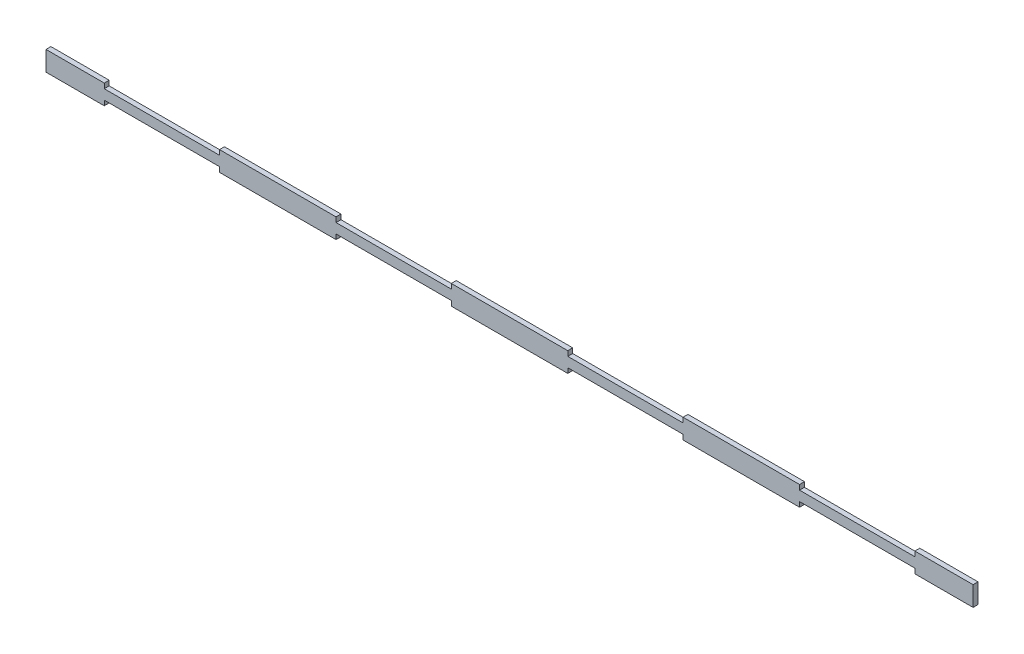
ISO-10303-21;
HEADER;
FILE_DESCRIPTION(('STEP AP214'),'2;1');
FILE_NAME('part.step','',(''),(''),'','','');
FILE_SCHEMA(('AUTOMOTIVE_DESIGN { 1 0 10303 214 1 1 1 1 }'));
ENDSEC;
DATA;
#1=APPLICATION_CONTEXT('core data for automotive mechanical design processes');
#2=APPLICATION_PROTOCOL_DEFINITION('international standard','automotive_design',2000,#1);
#3=PRODUCT_CONTEXT('',#1,'mechanical');
#4=PRODUCT('Part','Part','',(#3));
#5=PRODUCT_RELATED_PRODUCT_CATEGORY('part','',(#4));
#6=PRODUCT_DEFINITION_FORMATION('','',#4);
#7=PRODUCT_DEFINITION_CONTEXT('part definition',#1,'design');
#8=PRODUCT_DEFINITION('design','',#6,#7);
#9=PRODUCT_DEFINITION_SHAPE('','',#8);
#10=(LENGTH_UNIT() NAMED_UNIT(*) SI_UNIT(.MILLI.,.METRE.));
#11=(NAMED_UNIT(*) PLANE_ANGLE_UNIT() SI_UNIT($,.RADIAN.));
#12=(NAMED_UNIT(*) SI_UNIT($,.STERADIAN.) SOLID_ANGLE_UNIT());
#13=UNCERTAINTY_MEASURE_WITH_UNIT(LENGTH_MEASURE(1.E-05),#10,'distance_accuracy_value','');
#14=(GEOMETRIC_REPRESENTATION_CONTEXT(3) GLOBAL_UNCERTAINTY_ASSIGNED_CONTEXT((#13)) GLOBAL_UNIT_ASSIGNED_CONTEXT((#10,
#11,#12)) REPRESENTATION_CONTEXT('',''));
#15=CARTESIAN_POINT('',(0.,0.,0.));
#16=DIRECTION('',(0.,0.,1.));
#17=DIRECTION('',(1.,0.,0.));
#18=AXIS2_PLACEMENT_3D('',#15,#16,#17);
#19=CARTESIAN_POINT('',(186.73125,0.,-3.175));
#20=DIRECTION('',(-1.,0.,0.));
#21=DIRECTION('',(0.,0.,1.));
#22=AXIS2_PLACEMENT_3D('',#19,#20,#21);
#23=PLANE('',#22);
#24=DIRECTION('',(0.,-1.,0.));
#25=VECTOR('',#24,1.);
#26=CARTESIAN_POINT('',(186.73125,0.,0.));
#27=LINE('',#26,#25);
#28=CARTESIAN_POINT('',(186.73125,-9.52499999999988,0.));
#29=VERTEX_POINT('',#28);
#30=CARTESIAN_POINT('',(186.73125,-12.6999999999999,0.));
#31=VERTEX_POINT('',#30);
#32=EDGE_CURVE('E309',#29,#31,#27,.T.);
#33=ORIENTED_EDGE('',*,*,#32,.T.);
#34=DIRECTION('',(0.,0.,1.));
#35=VECTOR('',#34,1.);
#36=CARTESIAN_POINT('',(186.73125,-12.6999999999999,-3.175));
#37=LINE('',#36,#35);
#38=CARTESIAN_POINT('',(186.73125,-12.6999999999999,-3.175));
#39=VERTEX_POINT('',#38);
#40=EDGE_CURVE('E12',#39,#31,#37,.T.);
#41=ORIENTED_EDGE('',*,*,#40,.F.);
#42=DIRECTION('',(0.,-1.,0.));
#43=VECTOR('',#42,1.);
#44=CARTESIAN_POINT('',(186.73125,0.,-3.175));
#45=LINE('',#44,#43);
#46=CARTESIAN_POINT('',(186.73125,-9.52499999999988,-3.175));
#47=VERTEX_POINT('',#46);
#48=EDGE_CURVE('E700',#47,#39,#45,.T.);
#49=ORIENTED_EDGE('',*,*,#48,.F.);
#50=DIRECTION('',(0.,0.,1.));
#51=VECTOR('',#50,1.);
#52=CARTESIAN_POINT('',(186.73125,-9.52499999999988,-3.175));
#53=LINE('',#52,#51);
#54=EDGE_CURVE('E49',#47,#29,#53,.T.);
#55=ORIENTED_EDGE('',*,*,#54,.T.);
#56=EDGE_LOOP('',(#33,#41,#49,#55));
#57=FACE_BOUND('',#56,.T.);
#58=ADVANCED_FACE('F46',(#57),#23,.F.);
#59=CARTESIAN_POINT('',(0.,-12.6999999999999,-3.175));
#60=DIRECTION('',(0.,1.,0.));
#61=DIRECTION('',(0.,0.,1.));
#62=AXIS2_PLACEMENT_3D('',#59,#60,#61);
#63=PLANE('',#62);
#64=DIRECTION('',(-1.,0.,0.));
#65=VECTOR('',#64,1.);
#66=CARTESIAN_POINT('',(0.,-12.6999999999999,0.));
#67=LINE('',#66,#65);
#68=CARTESIAN_POINT('',(111.71875,-12.6999999999999,0.));
#69=VERTEX_POINT('',#68);
#70=EDGE_CURVE('E181',#31,#69,#67,.T.);
#71=ORIENTED_EDGE('',*,*,#70,.T.);
#72=DIRECTION('',(0.,0.,1.));
#73=VECTOR('',#72,1.);
#74=CARTESIAN_POINT('',(111.71875,-12.6999999999999,-3.175));
#75=LINE('',#74,#73);
#76=CARTESIAN_POINT('',(111.71875,-12.6999999999999,-3.175));
#77=VERTEX_POINT('',#76);
#78=EDGE_CURVE('E55',#77,#69,#75,.T.);
#79=ORIENTED_EDGE('',*,*,#78,.F.);
#80=DIRECTION('',(-1.,0.,0.));
#81=VECTOR('',#80,1.);
#82=CARTESIAN_POINT('',(0.,-12.6999999999999,-3.175));
#83=LINE('',#82,#81);
#84=EDGE_CURVE('E63',#39,#77,#83,.T.);
#85=ORIENTED_EDGE('',*,*,#84,.F.);
#86=ORIENTED_EDGE('',*,*,#40,.T.);
#87=EDGE_LOOP('',(#71,#79,#85,#86));
#88=FACE_BOUND('',#87,.T.);
#89=ADVANCED_FACE('F626',(#88),#63,.F.);
#90=CARTESIAN_POINT('',(111.71875,0.,-3.175));
#91=DIRECTION('',(-1.,0.,0.));
#92=DIRECTION('',(0.,0.,1.));
#93=AXIS2_PLACEMENT_3D('',#90,#91,#92);
#94=PLANE('',#93);
#95=DIRECTION('',(0.,-1.,0.));
#96=VECTOR('',#95,1.);
#97=CARTESIAN_POINT('',(111.71875,0.,0.));
#98=LINE('',#97,#96);
#99=CARTESIAN_POINT('',(111.71875,-9.52499999999986,0.));
#100=VERTEX_POINT('',#99);
#101=EDGE_CURVE('E289',#100,#69,#98,.T.);
#102=ORIENTED_EDGE('',*,*,#101,.F.);
#103=DIRECTION('',(0.,0.,1.));
#104=VECTOR('',#103,1.);
#105=CARTESIAN_POINT('',(111.71875,-9.52499999999986,-3.175));
#106=LINE('',#105,#104);
#107=CARTESIAN_POINT('',(111.71875,-9.52499999999986,-3.175));
#108=VERTEX_POINT('',#107);
#109=EDGE_CURVE('E285',#108,#100,#106,.T.);
#110=ORIENTED_EDGE('',*,*,#109,.F.);
#111=DIRECTION('',(0.,-1.,0.));
#112=VECTOR('',#111,1.);
#113=CARTESIAN_POINT('',(111.71875,0.,-3.175));
#114=LINE('',#113,#112);
#115=EDGE_CURVE('E288',#108,#77,#114,.T.);
#116=ORIENTED_EDGE('',*,*,#115,.T.);
#117=ORIENTED_EDGE('',*,*,#78,.T.);
#118=EDGE_LOOP('',(#102,#110,#116,#117));
#119=FACE_BOUND('',#118,.T.);
#120=ADVANCED_FACE('F287',(#119),#94,.T.);
#121=CARTESIAN_POINT('',(0.,-9.52499999999986,-3.175));
#122=DIRECTION('',(0.,-1.,0.));
#123=DIRECTION('',(0.,0.,-1.));
#124=AXIS2_PLACEMENT_3D('',#121,#122,#123);
#125=PLANE('',#124);
#126=DIRECTION('',(1.,0.,0.));
#127=VECTOR('',#126,1.);
#128=CARTESIAN_POINT('',(0.,-9.52499999999986,0.));
#129=LINE('',#128,#127);
#130=CARTESIAN_POINT('',(37.50625,-9.52499999999986,0.));
#131=VERTEX_POINT('',#130);
#132=EDGE_CURVE('E704',#131,#100,#129,.T.);
#133=ORIENTED_EDGE('',*,*,#132,.F.);
#134=DIRECTION('',(0.,0.,1.));
#135=VECTOR('',#134,1.);
#136=CARTESIAN_POINT('',(37.50625,-9.52499999999986,-3.175));
#137=LINE('',#136,#135);
#138=CARTESIAN_POINT('',(37.50625,-9.52499999999986,-3.175));
#139=VERTEX_POINT('',#138);
#140=EDGE_CURVE('E294',#139,#131,#137,.T.);
#141=ORIENTED_EDGE('',*,*,#140,.F.);
#142=DIRECTION('',(1.,0.,0.));
#143=VECTOR('',#142,1.);
#144=CARTESIAN_POINT('',(0.,-9.52499999999986,-3.175));
#145=LINE('',#144,#143);
#146=EDGE_CURVE('E299',#139,#108,#145,.T.);
#147=ORIENTED_EDGE('',*,*,#146,.T.);
#148=ORIENTED_EDGE('',*,*,#109,.T.);
#149=EDGE_LOOP('',(#133,#141,#147,#148));
#150=FACE_BOUND('',#149,.T.);
#151=ADVANCED_FACE('F301',(#150),#125,.T.);
#152=CARTESIAN_POINT('',(37.50625,0.,-3.175));
#153=DIRECTION('',(-1.,0.,0.));
#154=DIRECTION('',(0.,0.,1.));
#155=AXIS2_PLACEMENT_3D('',#152,#153,#154);
#156=PLANE('',#155);
#157=DIRECTION('',(0.,-1.,0.));
#158=VECTOR('',#157,1.);
#159=CARTESIAN_POINT('',(37.50625,0.,0.));
#160=LINE('',#159,#158);
#161=CARTESIAN_POINT('',(37.50625,-12.6999999999999,0.));
#162=VERTEX_POINT('',#161);
#163=EDGE_CURVE('E706',#131,#162,#160,.T.);
#164=ORIENTED_EDGE('',*,*,#163,.T.);
#165=DIRECTION('',(0.,0.,1.));
#166=VECTOR('',#165,1.);
#167=CARTESIAN_POINT('',(37.50625,-12.6999999999999,-3.175));
#168=LINE('',#167,#166);
#169=CARTESIAN_POINT('',(37.50625,-12.6999999999999,-3.175));
#170=VERTEX_POINT('',#169);
#171=EDGE_CURVE('E724',#170,#162,#168,.T.);
#172=ORIENTED_EDGE('',*,*,#171,.F.);
#173=DIRECTION('',(0.,-1.,0.));
#174=VECTOR('',#173,1.);
#175=CARTESIAN_POINT('',(37.50625,0.,-3.175));
#176=LINE('',#175,#174);
#177=EDGE_CURVE('E303',#139,#170,#176,.T.);
#178=ORIENTED_EDGE('',*,*,#177,.F.);
#179=ORIENTED_EDGE('',*,*,#140,.T.);
#180=EDGE_LOOP('',(#164,#172,#178,#179));
#181=FACE_BOUND('',#180,.T.);
#182=ADVANCED_FACE('F730',(#181),#156,.F.);
#183=CARTESIAN_POINT('',(-37.50625,-12.6999999999999,0.));
#184=VERTEX_POINT('',#183);
#185=EDGE_CURVE('E703',#162,#184,#67,.T.);
#186=ORIENTED_EDGE('',*,*,#185,.T.);
#187=DIRECTION('',(0.,0.,1.));
#188=VECTOR('',#187,1.);
#189=CARTESIAN_POINT('',(-37.50625,-12.6999999999999,-3.175));
#190=LINE('',#189,#188);
#191=CARTESIAN_POINT('',(-37.50625,-12.6999999999999,-3.175));
#192=VERTEX_POINT('',#191);
#193=EDGE_CURVE('E469',#192,#184,#190,.T.);
#194=ORIENTED_EDGE('',*,*,#193,.F.);
#195=EDGE_CURVE('E305',#170,#192,#83,.T.);
#196=ORIENTED_EDGE('',*,*,#195,.F.);
#197=ORIENTED_EDGE('',*,*,#171,.T.);
#198=EDGE_LOOP('',(#186,#194,#196,#197));
#199=FACE_BOUND('',#198,.T.);
#200=ADVANCED_FACE('F632',(#199),#63,.F.);
#201=CARTESIAN_POINT('',(-37.50625,0.,-3.175));
#202=DIRECTION('',(-1.,0.,0.));
#203=DIRECTION('',(0.,0.,1.));
#204=AXIS2_PLACEMENT_3D('',#201,#202,#203);
#205=PLANE('',#204);
#206=DIRECTION('',(0.,-1.,0.));
#207=VECTOR('',#206,1.);
#208=CARTESIAN_POINT('',(-37.50625,0.,0.));
#209=LINE('',#208,#207);
#210=CARTESIAN_POINT('',(-37.50625,-9.52499999999984,0.));
#211=VERTEX_POINT('',#210);
#212=EDGE_CURVE('E707',#211,#184,#209,.T.);
#213=ORIENTED_EDGE('',*,*,#212,.F.);
#214=DIRECTION('',(0.,0.,1.));
#215=VECTOR('',#214,1.);
#216=CARTESIAN_POINT('',(-37.50625,-9.52499999999984,-3.175));
#217=LINE('',#216,#215);
#218=CARTESIAN_POINT('',(-37.50625,-9.52499999999984,-3.175));
#219=VERTEX_POINT('',#218);
#220=EDGE_CURVE('E471',#219,#211,#217,.T.);
#221=ORIENTED_EDGE('',*,*,#220,.F.);
#222=DIRECTION('',(0.,-1.,0.));
#223=VECTOR('',#222,1.);
#224=CARTESIAN_POINT('',(-37.50625,0.,-3.175));
#225=LINE('',#224,#223);
#226=EDGE_CURVE('E428',#219,#192,#225,.T.);
#227=ORIENTED_EDGE('',*,*,#226,.T.);
#228=ORIENTED_EDGE('',*,*,#193,.T.);
#229=EDGE_LOOP('',(#213,#221,#227,#228));
#230=FACE_BOUND('',#229,.T.);
#231=ADVANCED_FACE('F467',(#230),#205,.T.);
#232=CARTESIAN_POINT('',(0.,-9.52499999999984,-3.175));
#233=DIRECTION('',(0.,-1.,0.));
#234=DIRECTION('',(0.,0.,-1.));
#235=AXIS2_PLACEMENT_3D('',#232,#233,#234);
#236=PLANE('',#235);
#237=DIRECTION('',(1.,0.,0.));
#238=VECTOR('',#237,1.);
#239=CARTESIAN_POINT('',(0.,-9.52499999999984,0.));
#240=LINE('',#239,#238);
#241=CARTESIAN_POINT('',(-111.71875,-9.52499999999984,0.));
#242=VERTEX_POINT('',#241);
#243=EDGE_CURVE('E480',#242,#211,#240,.T.);
#244=ORIENTED_EDGE('',*,*,#243,.F.);
#245=DIRECTION('',(0.,0.,1.));
#246=VECTOR('',#245,1.);
#247=CARTESIAN_POINT('',(-111.71875,-9.52499999999984,-3.175));
#248=LINE('',#247,#246);
#249=CARTESIAN_POINT('',(-111.71875,-9.52499999999984,-3.175));
#250=VERTEX_POINT('',#249);
#251=EDGE_CURVE('E477',#250,#242,#248,.T.);
#252=ORIENTED_EDGE('',*,*,#251,.F.);
#253=DIRECTION('',(1.,0.,0.));
#254=VECTOR('',#253,1.);
#255=CARTESIAN_POINT('',(0.,-9.52499999999984,-3.175));
#256=LINE('',#255,#254);
#257=EDGE_CURVE('E454',#250,#219,#256,.T.);
#258=ORIENTED_EDGE('',*,*,#257,.T.);
#259=ORIENTED_EDGE('',*,*,#220,.T.);
#260=EDGE_LOOP('',(#244,#252,#258,#259));
#261=FACE_BOUND('',#260,.T.);
#262=ADVANCED_FACE('F476',(#261),#236,.T.);
#263=CARTESIAN_POINT('',(-111.71875,0.,-3.175));
#264=DIRECTION('',(-1.,0.,0.));
#265=DIRECTION('',(0.,0.,1.));
#266=AXIS2_PLACEMENT_3D('',#263,#264,#265);
#267=PLANE('',#266);
#268=DIRECTION('',(0.,-1.,0.));
#269=VECTOR('',#268,1.);
#270=CARTESIAN_POINT('',(-111.71875,0.,0.));
#271=LINE('',#270,#269);
#272=CARTESIAN_POINT('',(-111.71875,-12.6999999999999,0.));
#273=VERTEX_POINT('',#272);
#274=EDGE_CURVE('E488',#242,#273,#271,.T.);
#275=ORIENTED_EDGE('',*,*,#274,.T.);
#276=DIRECTION('',(0.,0.,1.));
#277=VECTOR('',#276,1.);
#278=CARTESIAN_POINT('',(-111.71875,-12.6999999999999,-3.175));
#279=LINE('',#278,#277);
#280=CARTESIAN_POINT('',(-111.71875,-12.6999999999999,-3.175));
#281=VERTEX_POINT('',#280);
#282=EDGE_CURVE('E483',#281,#273,#279,.T.);
#283=ORIENTED_EDGE('',*,*,#282,.F.);
#284=DIRECTION('',(0.,-1.,0.));
#285=VECTOR('',#284,1.);
#286=CARTESIAN_POINT('',(-111.71875,0.,-3.175));
#287=LINE('',#286,#285);
#288=EDGE_CURVE('E449',#250,#281,#287,.T.);
#289=ORIENTED_EDGE('',*,*,#288,.F.);
#290=ORIENTED_EDGE('',*,*,#251,.T.);
#291=EDGE_LOOP('',(#275,#283,#289,#290));
#292=FACE_BOUND('',#291,.T.);
#293=ADVANCED_FACE('F486',(#292),#267,.F.);
#294=CARTESIAN_POINT('',(-186.73125,-12.6999999999999,0.));
#295=VERTEX_POINT('',#294);
#296=EDGE_CURVE('E495',#273,#295,#67,.T.);
#297=ORIENTED_EDGE('',*,*,#296,.T.);
#298=DIRECTION('',(0.,0.,1.));
#299=VECTOR('',#298,1.);
#300=CARTESIAN_POINT('',(-186.73125,-12.6999999999999,-3.175));
#301=LINE('',#300,#299);
#302=CARTESIAN_POINT('',(-186.73125,-12.6999999999999,-3.175));
#303=VERTEX_POINT('',#302);
#304=EDGE_CURVE('E492',#303,#295,#301,.T.);
#305=ORIENTED_EDGE('',*,*,#304,.F.);
#306=EDGE_CURVE('E429',#281,#303,#83,.T.);
#307=ORIENTED_EDGE('',*,*,#306,.F.);
#308=ORIENTED_EDGE('',*,*,#282,.T.);
#309=EDGE_LOOP('',(#297,#305,#307,#308));
#310=FACE_BOUND('',#309,.T.);
#311=ADVANCED_FACE('F494',(#310),#63,.F.);
#312=CARTESIAN_POINT('',(-186.73125,0.,-3.175));
#313=DIRECTION('',(-1.,0.,0.));
#314=DIRECTION('',(0.,0.,1.));
#315=AXIS2_PLACEMENT_3D('',#312,#313,#314);
#316=PLANE('',#315);
#317=DIRECTION('',(0.,-1.,0.));
#318=VECTOR('',#317,1.);
#319=CARTESIAN_POINT('',(-186.73125,0.,0.));
#320=LINE('',#319,#318);
#321=CARTESIAN_POINT('',(-186.73125,-9.52499999999982,0.));
#322=VERTEX_POINT('',#321);
#323=EDGE_CURVE('E714',#322,#295,#320,.T.);
#324=ORIENTED_EDGE('',*,*,#323,.F.);
#325=DIRECTION('',(0.,0.,1.));
#326=VECTOR('',#325,1.);
#327=CARTESIAN_POINT('',(-186.73125,-9.52499999999982,-3.175));
#328=LINE('',#327,#326);
#329=CARTESIAN_POINT('',(-186.73125,-9.52499999999982,-3.175));
#330=VERTEX_POINT('',#329);
#331=EDGE_CURVE('E498',#330,#322,#328,.T.);
#332=ORIENTED_EDGE('',*,*,#331,.F.);
#333=DIRECTION('',(0.,-1.,0.));
#334=VECTOR('',#333,1.);
#335=CARTESIAN_POINT('',(-186.73125,0.,-3.175));
#336=LINE('',#335,#334);
#337=EDGE_CURVE('E450',#330,#303,#336,.T.);
#338=ORIENTED_EDGE('',*,*,#337,.T.);
#339=ORIENTED_EDGE('',*,*,#304,.T.);
#340=EDGE_LOOP('',(#324,#332,#338,#339));
#341=FACE_BOUND('',#340,.T.);
#342=ADVANCED_FACE('F746',(#341),#316,.T.);
#343=CARTESIAN_POINT('',(0.,-9.52499999999982,-3.175));
#344=DIRECTION('',(0.,-1.,0.));
#345=DIRECTION('',(0.,0.,-1.));
#346=AXIS2_PLACEMENT_3D('',#343,#344,#345);
#347=PLANE('',#346);
#348=DIRECTION('',(1.,0.,0.));
#349=VECTOR('',#348,1.);
#350=CARTESIAN_POINT('',(0.,-9.52499999999982,0.));
#351=LINE('',#350,#349);
#352=CARTESIAN_POINT('',(-260.94375,-9.52499999999982,0.));
#353=VERTEX_POINT('',#352);
#354=EDGE_CURVE('E716',#353,#322,#351,.T.);
#355=ORIENTED_EDGE('',*,*,#354,.F.);
#356=DIRECTION('',(0.,0.,1.));
#357=VECTOR('',#356,1.);
#358=CARTESIAN_POINT('',(-260.94375,-9.52499999999982,-3.175));
#359=LINE('',#358,#357);
#360=CARTESIAN_POINT('',(-260.94375,-9.52499999999982,-3.175));
#361=VERTEX_POINT('',#360);
#362=EDGE_CURVE('E500',#361,#353,#359,.T.);
#363=ORIENTED_EDGE('',*,*,#362,.F.);
#364=DIRECTION('',(1.,0.,0.));
#365=VECTOR('',#364,1.);
#366=CARTESIAN_POINT('',(0.,-9.52499999999982,-3.175));
#367=LINE('',#366,#365);
#368=EDGE_CURVE('E444',#361,#330,#367,.T.);
#369=ORIENTED_EDGE('',*,*,#368,.T.);
#370=ORIENTED_EDGE('',*,*,#331,.T.);
#371=EDGE_LOOP('',(#355,#363,#369,#370));
#372=FACE_BOUND('',#371,.T.);
#373=ADVANCED_FACE('F749',(#372),#347,.T.);
#374=CARTESIAN_POINT('',(-260.94375,0.,-3.175));
#375=DIRECTION('',(-1.,0.,0.));
#376=DIRECTION('',(0.,0.,1.));
#377=AXIS2_PLACEMENT_3D('',#374,#375,#376);
#378=PLANE('',#377);
#379=DIRECTION('',(0.,-1.,0.));
#380=VECTOR('',#379,1.);
#381=CARTESIAN_POINT('',(-260.94375,0.,0.));
#382=LINE('',#381,#380);
#383=CARTESIAN_POINT('',(-260.94375,-12.6999999999999,0.));
#384=VERTEX_POINT('',#383);
#385=EDGE_CURVE('E368',#353,#384,#382,.T.);
#386=ORIENTED_EDGE('',*,*,#385,.T.);
#387=DIRECTION('',(0.,0.,1.));
#388=VECTOR('',#387,1.);
#389=CARTESIAN_POINT('',(-260.94375,-12.6999999999999,-3.175));
#390=LINE('',#389,#388);
#391=CARTESIAN_POINT('',(-260.94375,-12.6999999999999,-3.175));
#392=VERTEX_POINT('',#391);
#393=EDGE_CURVE('E503',#392,#384,#390,.T.);
#394=ORIENTED_EDGE('',*,*,#393,.F.);
#395=DIRECTION('',(0.,-1.,0.));
#396=VECTOR('',#395,1.);
#397=CARTESIAN_POINT('',(-260.94375,0.,-3.175));
#398=LINE('',#397,#396);
#399=EDGE_CURVE('E439',#361,#392,#398,.T.);
#400=ORIENTED_EDGE('',*,*,#399,.F.);
#401=ORIENTED_EDGE('',*,*,#362,.T.);
#402=EDGE_LOOP('',(#386,#394,#400,#401));
#403=FACE_BOUND('',#402,.T.);
#404=ADVANCED_FACE('F752',(#403),#378,.F.);
#405=CARTESIAN_POINT('',(-298.45,-12.6999999999999,0.));
#406=VERTEX_POINT('',#405);
#407=EDGE_CURVE('E322',#384,#406,#67,.T.);
#408=ORIENTED_EDGE('',*,*,#407,.T.);
#409=DIRECTION('',(0.,0.,1.));
#410=VECTOR('',#409,1.);
#411=CARTESIAN_POINT('',(-298.45,-12.6999999999999,-3.175));
#412=LINE('',#411,#410);
#413=CARTESIAN_POINT('',(-298.45,-12.6999999999999,-3.175));
#414=VERTEX_POINT('',#413);
#415=EDGE_CURVE('E376',#414,#406,#412,.T.);
#416=ORIENTED_EDGE('',*,*,#415,.F.);
#417=EDGE_CURVE('E432',#392,#414,#83,.T.);
#418=ORIENTED_EDGE('',*,*,#417,.F.);
#419=ORIENTED_EDGE('',*,*,#393,.T.);
#420=EDGE_LOOP('',(#408,#416,#418,#419));
#421=FACE_BOUND('',#420,.T.);
#422=ADVANCED_FACE('F514',(#421),#63,.F.);
#423=CARTESIAN_POINT('',(-298.45,0.,-3.175));
#424=DIRECTION('',(-1.,0.,0.));
#425=DIRECTION('',(0.,0.,1.));
#426=AXIS2_PLACEMENT_3D('',#423,#424,#425);
#427=PLANE('',#426);
#428=DIRECTION('',(0.,-1.,0.));
#429=VECTOR('',#428,1.);
#430=CARTESIAN_POINT('',(-298.45,0.,0.));
#431=LINE('',#430,#429);
#432=CARTESIAN_POINT('',(-298.45,0.,0.));
#433=VERTEX_POINT('',#432);
#434=EDGE_CURVE('E363',#433,#406,#431,.T.);
#435=ORIENTED_EDGE('',*,*,#434,.F.);
#436=DIRECTION('',(0.,0.,1.));
#437=VECTOR('',#436,1.);
#438=CARTESIAN_POINT('',(-298.45,0.,-3.175));
#439=LINE('',#438,#437);
#440=CARTESIAN_POINT('',(-298.45,0.,-3.175));
#441=VERTEX_POINT('',#440);
#442=EDGE_CURVE('E372',#441,#433,#439,.T.);
#443=ORIENTED_EDGE('',*,*,#442,.F.);
#444=DIRECTION('',(0.,-1.,0.));
#445=VECTOR('',#444,1.);
#446=CARTESIAN_POINT('',(-298.45,0.,-3.175));
#447=LINE('',#446,#445);
#448=EDGE_CURVE('E440',#441,#414,#447,.T.);
#449=ORIENTED_EDGE('',*,*,#448,.T.);
#450=ORIENTED_EDGE('',*,*,#415,.T.);
#451=EDGE_LOOP('',(#435,#443,#449,#450));
#452=FACE_BOUND('',#451,.T.);
#453=ADVANCED_FACE('F512',(#452),#427,.T.);
#454=CARTESIAN_POINT('',(0.,0.,-3.175));
#455=DIRECTION('',(0.,1.,0.));
#456=DIRECTION('',(0.,0.,1.));
#457=AXIS2_PLACEMENT_3D('',#454,#455,#456);
#458=PLANE('',#457);
#459=DIRECTION('',(-1.,0.,0.));
#460=VECTOR('',#459,1.);
#461=CARTESIAN_POINT('',(0.,0.,0.));
#462=LINE('',#461,#460);
#463=CARTESIAN_POINT('',(-260.94375,0.,0.));
#464=VERTEX_POINT('',#463);
#465=EDGE_CURVE('E328',#464,#433,#462,.T.);
#466=ORIENTED_EDGE('',*,*,#465,.F.);
#467=DIRECTION('',(0.,0.,1.));
#468=VECTOR('',#467,1.);
#469=CARTESIAN_POINT('',(-260.94375,0.,-3.175));
#470=LINE('',#469,#468);
#471=CARTESIAN_POINT('',(-260.94375,0.,-3.175));
#472=VERTEX_POINT('',#471);
#473=EDGE_CURVE('E377',#472,#464,#470,.T.);
#474=ORIENTED_EDGE('',*,*,#473,.F.);
#475=DIRECTION('',(-1.,0.,0.));
#476=VECTOR('',#475,1.);
#477=CARTESIAN_POINT('',(0.,0.,-3.175));
#478=LINE('',#477,#476);
#479=EDGE_CURVE('E447',#472,#441,#478,.T.);
#480=ORIENTED_EDGE('',*,*,#479,.T.);
#481=ORIENTED_EDGE('',*,*,#442,.T.);
#482=EDGE_LOOP('',(#466,#474,#480,#481));
#483=FACE_BOUND('',#482,.T.);
#484=ADVANCED_FACE('F592',(#483),#458,.T.);
#485=CARTESIAN_POINT('',(-260.94375,0.,-3.175));
#486=DIRECTION('',(1.,0.,0.));
#487=DIRECTION('',(0.,0.,-1.));
#488=AXIS2_PLACEMENT_3D('',#485,#486,#487);
#489=PLANE('',#488);
#490=DIRECTION('',(0.,1.,0.));
#491=VECTOR('',#490,1.);
#492=CARTESIAN_POINT('',(-260.94375,0.,0.));
#493=LINE('',#492,#491);
#494=CARTESIAN_POINT('',(-260.94375,-3.17500000000007,0.));
#495=VERTEX_POINT('',#494);
#496=EDGE_CURVE('E360',#495,#464,#493,.T.);
#497=ORIENTED_EDGE('',*,*,#496,.F.);
#498=DIRECTION('',(0.,0.,1.));
#499=VECTOR('',#498,1.);
#500=CARTESIAN_POINT('',(-260.94375,-3.17500000000007,-3.175));
#501=LINE('',#500,#499);
#502=CARTESIAN_POINT('',(-260.94375,-3.17500000000007,-3.175));
#503=VERTEX_POINT('',#502);
#504=EDGE_CURVE('E381',#503,#495,#501,.T.);
#505=ORIENTED_EDGE('',*,*,#504,.F.);
#506=DIRECTION('',(0.,1.,0.));
#507=VECTOR('',#506,1.);
#508=CARTESIAN_POINT('',(-260.94375,0.,-3.175));
#509=LINE('',#508,#507);
#510=EDGE_CURVE('E589',#503,#472,#509,.T.);
#511=ORIENTED_EDGE('',*,*,#510,.T.);
#512=ORIENTED_EDGE('',*,*,#473,.T.);
#513=EDGE_LOOP('',(#497,#505,#511,#512));
#514=FACE_BOUND('',#513,.T.);
#515=ADVANCED_FACE('F585',(#514),#489,.T.);
#516=CARTESIAN_POINT('',(0.,-3.17500000000007,-3.175));
#517=DIRECTION('',(0.,-1.,0.));
#518=DIRECTION('',(0.,0.,-1.));
#519=AXIS2_PLACEMENT_3D('',#516,#517,#518);
#520=PLANE('',#519);
#521=DIRECTION('',(1.,0.,0.));
#522=VECTOR('',#521,1.);
#523=CARTESIAN_POINT('',(0.,-3.17500000000007,0.));
#524=LINE('',#523,#522);
#525=CARTESIAN_POINT('',(-186.73125,-3.17500000000007,0.));
#526=VERTEX_POINT('',#525);
#527=EDGE_CURVE('E358',#495,#526,#524,.T.);
#528=ORIENTED_EDGE('',*,*,#527,.T.);
#529=DIRECTION('',(0.,0.,1.));
#530=VECTOR('',#529,1.);
#531=CARTESIAN_POINT('',(-186.73125,-3.17500000000007,-3.175));
#532=LINE('',#531,#530);
#533=CARTESIAN_POINT('',(-186.73125,-3.17500000000007,-3.175));
#534=VERTEX_POINT('',#533);
#535=EDGE_CURVE('E383',#534,#526,#532,.T.);
#536=ORIENTED_EDGE('',*,*,#535,.F.);
#537=DIRECTION('',(1.,0.,0.));
#538=VECTOR('',#537,1.);
#539=CARTESIAN_POINT('',(0.,-3.17500000000007,-3.175));
#540=LINE('',#539,#538);
#541=EDGE_CURVE('E594',#503,#534,#540,.T.);
#542=ORIENTED_EDGE('',*,*,#541,.F.);
#543=ORIENTED_EDGE('',*,*,#504,.T.);
#544=EDGE_LOOP('',(#528,#536,#542,#543));
#545=FACE_BOUND('',#544,.T.);
#546=ADVANCED_FACE('F616',(#545),#520,.F.);
#547=CARTESIAN_POINT('',(-186.73125,0.,-3.175));
#548=DIRECTION('',(1.,0.,0.));
#549=DIRECTION('',(0.,0.,-1.));
#550=AXIS2_PLACEMENT_3D('',#547,#548,#549);
#551=PLANE('',#550);
#552=DIRECTION('',(0.,1.,0.));
#553=VECTOR('',#552,1.);
#554=CARTESIAN_POINT('',(-186.73125,0.,0.));
#555=LINE('',#554,#553);
#556=CARTESIAN_POINT('',(-186.73125,0.,0.));
#557=VERTEX_POINT('',#556);
#558=EDGE_CURVE('E355',#526,#557,#555,.T.);
#559=ORIENTED_EDGE('',*,*,#558,.T.);
#560=DIRECTION('',(0.,0.,1.));
#561=VECTOR('',#560,1.);
#562=CARTESIAN_POINT('',(-186.73125,0.,-3.175));
#563=LINE('',#562,#561);
#564=CARTESIAN_POINT('',(-186.73125,0.,-3.175));
#565=VERTEX_POINT('',#564);
#566=EDGE_CURVE('E386',#565,#557,#563,.T.);
#567=ORIENTED_EDGE('',*,*,#566,.F.);
#568=DIRECTION('',(0.,1.,0.));
#569=VECTOR('',#568,1.);
#570=CARTESIAN_POINT('',(-186.73125,0.,-3.175));
#571=LINE('',#570,#569);
#572=EDGE_CURVE('E597',#534,#565,#571,.T.);
#573=ORIENTED_EDGE('',*,*,#572,.F.);
#574=ORIENTED_EDGE('',*,*,#535,.T.);
#575=EDGE_LOOP('',(#559,#567,#573,#574));
#576=FACE_BOUND('',#575,.T.);
#577=ADVANCED_FACE('F581',(#576),#551,.F.);
#578=CARTESIAN_POINT('',(-111.71875,0.,0.));
#579=VERTEX_POINT('',#578);
#580=EDGE_CURVE('E354',#579,#557,#462,.T.);
#581=ORIENTED_EDGE('',*,*,#580,.F.);
#582=DIRECTION('',(0.,0.,1.));
#583=VECTOR('',#582,1.);
#584=CARTESIAN_POINT('',(-111.71875,0.,-3.175));
#585=LINE('',#584,#583);
#586=CARTESIAN_POINT('',(-111.71875,0.,-3.175));
#587=VERTEX_POINT('',#586);
#588=EDGE_CURVE('E388',#587,#579,#585,.T.);
#589=ORIENTED_EDGE('',*,*,#588,.F.);
#590=EDGE_CURVE('E578',#587,#565,#478,.T.);
#591=ORIENTED_EDGE('',*,*,#590,.T.);
#592=ORIENTED_EDGE('',*,*,#566,.T.);
#593=EDGE_LOOP('',(#581,#589,#591,#592));
#594=FACE_BOUND('',#593,.T.);
#595=ADVANCED_FACE('F576',(#594),#458,.T.);
#596=CARTESIAN_POINT('',(-111.71875,0.,-3.175));
#597=DIRECTION('',(1.,0.,0.));
#598=DIRECTION('',(0.,0.,-1.));
#599=AXIS2_PLACEMENT_3D('',#596,#597,#598);
#600=PLANE('',#599);
#601=DIRECTION('',(0.,1.,0.));
#602=VECTOR('',#601,1.);
#603=CARTESIAN_POINT('',(-111.71875,0.,0.));
#604=LINE('',#603,#602);
#605=CARTESIAN_POINT('',(-111.71875,-3.17500000000005,0.));
#606=VERTEX_POINT('',#605);
#607=EDGE_CURVE('E351',#606,#579,#604,.T.);
#608=ORIENTED_EDGE('',*,*,#607,.F.);
#609=DIRECTION('',(0.,0.,1.));
#610=VECTOR('',#609,1.);
#611=CARTESIAN_POINT('',(-111.71875,-3.17500000000005,-3.175));
#612=LINE('',#611,#610);
#613=CARTESIAN_POINT('',(-111.71875,-3.17500000000005,-3.175));
#614=VERTEX_POINT('',#613);
#615=EDGE_CURVE('E390',#614,#606,#612,.T.);
#616=ORIENTED_EDGE('',*,*,#615,.F.);
#617=DIRECTION('',(0.,1.,0.));
#618=VECTOR('',#617,1.);
#619=CARTESIAN_POINT('',(-111.71875,0.,-3.175));
#620=LINE('',#619,#618);
#621=EDGE_CURVE('E572',#614,#587,#620,.T.);
#622=ORIENTED_EDGE('',*,*,#621,.T.);
#623=ORIENTED_EDGE('',*,*,#588,.T.);
#624=EDGE_LOOP('',(#608,#616,#622,#623));
#625=FACE_BOUND('',#624,.T.);
#626=ADVANCED_FACE('F568',(#625),#600,.T.);
#627=CARTESIAN_POINT('',(0.,-3.17500000000005,-3.175));
#628=DIRECTION('',(0.,-1.,0.));
#629=DIRECTION('',(0.,0.,-1.));
#630=AXIS2_PLACEMENT_3D('',#627,#628,#629);
#631=PLANE('',#630);
#632=DIRECTION('',(1.,0.,0.));
#633=VECTOR('',#632,1.);
#634=CARTESIAN_POINT('',(0.,-3.17500000000005,0.));
#635=LINE('',#634,#633);
#636=CARTESIAN_POINT('',(-37.50625,-3.17500000000005,0.));
#637=VERTEX_POINT('',#636);
#638=EDGE_CURVE('E349',#606,#637,#635,.T.);
#639=ORIENTED_EDGE('',*,*,#638,.T.);
#640=DIRECTION('',(0.,0.,1.));
#641=VECTOR('',#640,1.);
#642=CARTESIAN_POINT('',(-37.50625,-3.17500000000005,-3.175));
#643=LINE('',#642,#641);
#644=CARTESIAN_POINT('',(-37.50625,-3.17500000000005,-3.175));
#645=VERTEX_POINT('',#644);
#646=EDGE_CURVE('E392',#645,#637,#643,.T.);
#647=ORIENTED_EDGE('',*,*,#646,.F.);
#648=DIRECTION('',(1.,0.,0.));
#649=VECTOR('',#648,1.);
#650=CARTESIAN_POINT('',(0.,-3.17500000000005,-3.175));
#651=LINE('',#650,#649);
#652=EDGE_CURVE('E608',#614,#645,#651,.T.);
#653=ORIENTED_EDGE('',*,*,#652,.F.);
#654=ORIENTED_EDGE('',*,*,#615,.T.);
#655=EDGE_LOOP('',(#639,#647,#653,#654));
#656=FACE_BOUND('',#655,.T.);
#657=ADVANCED_FACE('F670',(#656),#631,.F.);
#658=CARTESIAN_POINT('',(-37.50625,0.,-3.175));
#659=DIRECTION('',(1.,0.,0.));
#660=DIRECTION('',(0.,0.,-1.));
#661=AXIS2_PLACEMENT_3D('',#658,#659,#660);
#662=PLANE('',#661);
#663=DIRECTION('',(0.,1.,0.));
#664=VECTOR('',#663,1.);
#665=CARTESIAN_POINT('',(-37.50625,0.,0.));
#666=LINE('',#665,#664);
#667=CARTESIAN_POINT('',(-37.50625,0.,0.));
#668=VERTEX_POINT('',#667);
#669=EDGE_CURVE('E346',#637,#668,#666,.T.);
#670=ORIENTED_EDGE('',*,*,#669,.T.);
#671=DIRECTION('',(0.,0.,1.));
#672=VECTOR('',#671,1.);
#673=CARTESIAN_POINT('',(-37.50625,0.,-3.175));
#674=LINE('',#673,#672);
#675=CARTESIAN_POINT('',(-37.50625,0.,-3.175));
#676=VERTEX_POINT('',#675);
#677=EDGE_CURVE('E395',#676,#668,#674,.T.);
#678=ORIENTED_EDGE('',*,*,#677,.F.);
#679=DIRECTION('',(0.,1.,0.));
#680=VECTOR('',#679,1.);
#681=CARTESIAN_POINT('',(-37.50625,0.,-3.175));
#682=LINE('',#681,#680);
#683=EDGE_CURVE('E607',#645,#676,#682,.T.);
#684=ORIENTED_EDGE('',*,*,#683,.F.);
#685=ORIENTED_EDGE('',*,*,#646,.T.);
#686=EDGE_LOOP('',(#670,#678,#684,#685));
#687=FACE_BOUND('',#686,.T.);
#688=ADVANCED_FACE('F562',(#687),#662,.F.);
#689=CARTESIAN_POINT('',(37.50625,0.,0.));
#690=VERTEX_POINT('',#689);
#691=EDGE_CURVE('E345',#690,#668,#462,.T.);
#692=ORIENTED_EDGE('',*,*,#691,.F.);
#693=DIRECTION('',(0.,0.,1.));
#694=VECTOR('',#693,1.);
#695=CARTESIAN_POINT('',(37.50625,0.,-3.175));
#696=LINE('',#695,#694);
#697=CARTESIAN_POINT('',(37.50625,0.,-3.175));
#698=VERTEX_POINT('',#697);
#699=EDGE_CURVE('E397',#698,#690,#696,.T.);
#700=ORIENTED_EDGE('',*,*,#699,.F.);
#701=EDGE_CURVE('E559',#698,#676,#478,.T.);
#702=ORIENTED_EDGE('',*,*,#701,.T.);
#703=ORIENTED_EDGE('',*,*,#677,.T.);
#704=EDGE_LOOP('',(#692,#700,#702,#703));
#705=FACE_BOUND('',#704,.T.);
#706=ADVANCED_FACE('F557',(#705),#458,.T.);
#707=CARTESIAN_POINT('',(37.50625,0.,-3.175));
#708=DIRECTION('',(1.,0.,0.));
#709=DIRECTION('',(0.,0.,-1.));
#710=AXIS2_PLACEMENT_3D('',#707,#708,#709);
#711=PLANE('',#710);
#712=DIRECTION('',(0.,1.,0.));
#713=VECTOR('',#712,1.);
#714=CARTESIAN_POINT('',(37.50625,0.,0.));
#715=LINE('',#714,#713);
#716=CARTESIAN_POINT('',(37.50625,-3.17500000000003,0.));
#717=VERTEX_POINT('',#716);
#718=EDGE_CURVE('E342',#717,#690,#715,.T.);
#719=ORIENTED_EDGE('',*,*,#718,.F.);
#720=DIRECTION('',(0.,0.,1.));
#721=VECTOR('',#720,1.);
#722=CARTESIAN_POINT('',(37.50625,-3.17500000000003,-3.175));
#723=LINE('',#722,#721);
#724=CARTESIAN_POINT('',(37.50625,-3.17500000000003,-3.175));
#725=VERTEX_POINT('',#724);
#726=EDGE_CURVE('E399',#725,#717,#723,.T.);
#727=ORIENTED_EDGE('',*,*,#726,.F.);
#728=DIRECTION('',(0.,1.,0.));
#729=VECTOR('',#728,1.);
#730=CARTESIAN_POINT('',(37.50625,0.,-3.175));
#731=LINE('',#730,#729);
#732=EDGE_CURVE('E553',#725,#698,#731,.T.);
#733=ORIENTED_EDGE('',*,*,#732,.T.);
#734=ORIENTED_EDGE('',*,*,#699,.T.);
#735=EDGE_LOOP('',(#719,#727,#733,#734));
#736=FACE_BOUND('',#735,.T.);
#737=ADVANCED_FACE('F551',(#736),#711,.T.);
#738=CARTESIAN_POINT('',(0.,-3.17500000000003,-3.175));
#739=DIRECTION('',(0.,-1.,0.));
#740=DIRECTION('',(0.,0.,-1.));
#741=AXIS2_PLACEMENT_3D('',#738,#739,#740);
#742=PLANE('',#741);
#743=DIRECTION('',(1.,0.,0.));
#744=VECTOR('',#743,1.);
#745=CARTESIAN_POINT('',(0.,-3.17500000000003,0.));
#746=LINE('',#745,#744);
#747=CARTESIAN_POINT('',(111.71875,-3.17500000000003,0.));
#748=VERTEX_POINT('',#747);
#749=EDGE_CURVE('E340',#717,#748,#746,.T.);
#750=ORIENTED_EDGE('',*,*,#749,.T.);
#751=DIRECTION('',(0.,0.,1.));
#752=VECTOR('',#751,1.);
#753=CARTESIAN_POINT('',(111.71875,-3.17500000000003,-3.175));
#754=LINE('',#753,#752);
#755=CARTESIAN_POINT('',(111.71875,-3.17500000000003,-3.175));
#756=VERTEX_POINT('',#755);
#757=EDGE_CURVE('E401',#756,#748,#754,.T.);
#758=ORIENTED_EDGE('',*,*,#757,.F.);
#759=DIRECTION('',(1.,0.,0.));
#760=VECTOR('',#759,1.);
#761=CARTESIAN_POINT('',(0.,-3.17500000000003,-3.175));
#762=LINE('',#761,#760);
#763=EDGE_CURVE('E547',#725,#756,#762,.T.);
#764=ORIENTED_EDGE('',*,*,#763,.F.);
#765=ORIENTED_EDGE('',*,*,#726,.T.);
#766=EDGE_LOOP('',(#750,#758,#764,#765));
#767=FACE_BOUND('',#766,.T.);
#768=ADVANCED_FACE('F546',(#767),#742,.F.);
#769=CARTESIAN_POINT('',(111.71875,0.,-3.175));
#770=DIRECTION('',(1.,0.,0.));
#771=DIRECTION('',(0.,0.,-1.));
#772=AXIS2_PLACEMENT_3D('',#769,#770,#771);
#773=PLANE('',#772);
#774=DIRECTION('',(0.,1.,0.));
#775=VECTOR('',#774,1.);
#776=CARTESIAN_POINT('',(111.71875,0.,0.));
#777=LINE('',#776,#775);
#778=CARTESIAN_POINT('',(111.71875,0.,0.));
#779=VERTEX_POINT('',#778);
#780=EDGE_CURVE('E337',#748,#779,#777,.T.);
#781=ORIENTED_EDGE('',*,*,#780,.T.);
#782=DIRECTION('',(0.,0.,1.));
#783=VECTOR('',#782,1.);
#784=CARTESIAN_POINT('',(111.71875,0.,-3.175));
#785=LINE('',#784,#783);
#786=CARTESIAN_POINT('',(111.71875,0.,-3.175));
#787=VERTEX_POINT('',#786);
#788=EDGE_CURVE('E404',#787,#779,#785,.T.);
#789=ORIENTED_EDGE('',*,*,#788,.F.);
#790=DIRECTION('',(0.,1.,0.));
#791=VECTOR('',#790,1.);
#792=CARTESIAN_POINT('',(111.71875,0.,-3.175));
#793=LINE('',#792,#791);
#794=EDGE_CURVE('E543',#756,#787,#793,.T.);
#795=ORIENTED_EDGE('',*,*,#794,.F.);
#796=ORIENTED_EDGE('',*,*,#757,.T.);
#797=EDGE_LOOP('',(#781,#789,#795,#796));
#798=FACE_BOUND('',#797,.T.);
#799=ADVANCED_FACE('F541',(#798),#773,.F.);
#800=CARTESIAN_POINT('',(186.73125,0.,0.));
#801=VERTEX_POINT('',#800);
#802=EDGE_CURVE('E329',#801,#779,#462,.T.);
#803=ORIENTED_EDGE('',*,*,#802,.F.);
#804=DIRECTION('',(0.,0.,1.));
#805=VECTOR('',#804,1.);
#806=CARTESIAN_POINT('',(186.73125,0.,-3.175));
#807=LINE('',#806,#805);
#808=CARTESIAN_POINT('',(186.73125,0.,-3.175));
#809=VERTEX_POINT('',#808);
#810=EDGE_CURVE('E406',#809,#801,#807,.T.);
#811=ORIENTED_EDGE('',*,*,#810,.F.);
#812=EDGE_CURVE('E538',#809,#787,#478,.T.);
#813=ORIENTED_EDGE('',*,*,#812,.T.);
#814=ORIENTED_EDGE('',*,*,#788,.T.);
#815=EDGE_LOOP('',(#803,#811,#813,#814));
#816=FACE_BOUND('',#815,.T.);
#817=ADVANCED_FACE('F534',(#816),#458,.T.);
#818=CARTESIAN_POINT('',(186.73125,0.,-3.175));
#819=DIRECTION('',(1.,0.,0.));
#820=DIRECTION('',(0.,0.,-1.));
#821=AXIS2_PLACEMENT_3D('',#818,#819,#820);
#822=PLANE('',#821);
#823=DIRECTION('',(0.,1.,0.));
#824=VECTOR('',#823,1.);
#825=CARTESIAN_POINT('',(186.73125,0.,0.));
#826=LINE('',#825,#824);
#827=CARTESIAN_POINT('',(186.73125,-3.17500000000001,0.));
#828=VERTEX_POINT('',#827);
#829=EDGE_CURVE('E334',#828,#801,#826,.T.);
#830=ORIENTED_EDGE('',*,*,#829,.F.);
#831=DIRECTION('',(0.,0.,1.));
#832=VECTOR('',#831,1.);
#833=CARTESIAN_POINT('',(186.73125,-3.17500000000001,-3.175));
#834=LINE('',#833,#832);
#835=CARTESIAN_POINT('',(186.73125,-3.17500000000001,-3.175));
#836=VERTEX_POINT('',#835);
#837=EDGE_CURVE('E408',#836,#828,#834,.T.);
#838=ORIENTED_EDGE('',*,*,#837,.F.);
#839=DIRECTION('',(0.,1.,0.));
#840=VECTOR('',#839,1.);
#841=CARTESIAN_POINT('',(186.73125,0.,-3.175));
#842=LINE('',#841,#840);
#843=EDGE_CURVE('E603',#836,#809,#842,.T.);
#844=ORIENTED_EDGE('',*,*,#843,.T.);
#845=ORIENTED_EDGE('',*,*,#810,.T.);
#846=EDGE_LOOP('',(#830,#838,#844,#845));
#847=FACE_BOUND('',#846,.T.);
#848=ADVANCED_FACE('F657',(#847),#822,.T.);
#849=CARTESIAN_POINT('',(0.,-3.17500000000001,-3.175));
#850=DIRECTION('',(0.,-1.,0.));
#851=DIRECTION('',(0.,0.,-1.));
#852=AXIS2_PLACEMENT_3D('',#849,#850,#851);
#853=PLANE('',#852);
#854=DIRECTION('',(1.,0.,0.));
#855=VECTOR('',#854,1.);
#856=CARTESIAN_POINT('',(0.,-3.17500000000001,0.));
#857=LINE('',#856,#855);
#858=CARTESIAN_POINT('',(260.94375,-3.17500000000001,0.));
#859=VERTEX_POINT('',#858);
#860=EDGE_CURVE('E332',#828,#859,#857,.T.);
#861=ORIENTED_EDGE('',*,*,#860,.T.);
#862=DIRECTION('',(0.,0.,1.));
#863=VECTOR('',#862,1.);
#864=CARTESIAN_POINT('',(260.94375,-3.17500000000001,-3.175));
#865=LINE('',#864,#863);
#866=CARTESIAN_POINT('',(260.94375,-3.17500000000001,-3.175));
#867=VERTEX_POINT('',#866);
#868=EDGE_CURVE('E410',#867,#859,#865,.T.);
#869=ORIENTED_EDGE('',*,*,#868,.F.);
#870=DIRECTION('',(1.,0.,0.));
#871=VECTOR('',#870,1.);
#872=CARTESIAN_POINT('',(0.,-3.17500000000001,-3.175));
#873=LINE('',#872,#871);
#874=EDGE_CURVE('E602',#836,#867,#873,.T.);
#875=ORIENTED_EDGE('',*,*,#874,.F.);
#876=ORIENTED_EDGE('',*,*,#837,.T.);
#877=EDGE_LOOP('',(#861,#869,#875,#876));
#878=FACE_BOUND('',#877,.T.);
#879=ADVANCED_FACE('F653',(#878),#853,.F.);
#880=CARTESIAN_POINT('',(260.94375,0.,-3.175));
#881=DIRECTION('',(1.,0.,0.));
#882=DIRECTION('',(0.,0.,-1.));
#883=AXIS2_PLACEMENT_3D('',#880,#881,#882);
#884=PLANE('',#883);
#885=DIRECTION('',(0.,1.,0.));
#886=VECTOR('',#885,1.);
#887=CARTESIAN_POINT('',(260.94375,0.,0.));
#888=LINE('',#887,#886);
#889=CARTESIAN_POINT('',(260.94375,0.,0.));
#890=VERTEX_POINT('',#889);
#891=EDGE_CURVE('E327',#859,#890,#888,.T.);
#892=ORIENTED_EDGE('',*,*,#891,.T.);
#893=DIRECTION('',(0.,0.,1.));
#894=VECTOR('',#893,1.);
#895=CARTESIAN_POINT('',(260.94375,0.,-3.175));
#896=LINE('',#895,#894);
#897=CARTESIAN_POINT('',(260.94375,0.,-3.175));
#898=VERTEX_POINT('',#897);
#899=EDGE_CURVE('E413',#898,#890,#896,.T.);
#900=ORIENTED_EDGE('',*,*,#899,.F.);
#901=DIRECTION('',(0.,1.,0.));
#902=VECTOR('',#901,1.);
#903=CARTESIAN_POINT('',(260.94375,0.,-3.175));
#904=LINE('',#903,#902);
#905=EDGE_CURVE('E599',#867,#898,#904,.T.);
#906=ORIENTED_EDGE('',*,*,#905,.F.);
#907=ORIENTED_EDGE('',*,*,#868,.T.);
#908=EDGE_LOOP('',(#892,#900,#906,#907));
#909=FACE_BOUND('',#908,.T.);
#910=ADVANCED_FACE('F650',(#909),#884,.F.);
#911=CARTESIAN_POINT('',(298.45,0.,0.));
#912=VERTEX_POINT('',#911);
#913=EDGE_CURVE('E324',#912,#890,#462,.T.);
#914=ORIENTED_EDGE('',*,*,#913,.F.);
#915=DIRECTION('',(0.,0.,1.));
#916=VECTOR('',#915,1.);
#917=CARTESIAN_POINT('',(298.45,0.,-3.175));
#918=LINE('',#917,#916);
#919=CARTESIAN_POINT('',(298.45,0.,-3.175));
#920=VERTEX_POINT('',#919);
#921=EDGE_CURVE('E415',#920,#912,#918,.T.);
#922=ORIENTED_EDGE('',*,*,#921,.F.);
#923=EDGE_CURVE('E436',#920,#898,#478,.T.);
#924=ORIENTED_EDGE('',*,*,#923,.T.);
#925=ORIENTED_EDGE('',*,*,#899,.T.);
#926=EDGE_LOOP('',(#914,#922,#924,#925));
#927=FACE_BOUND('',#926,.T.);
#928=ADVANCED_FACE('F648',(#927),#458,.T.);
#929=CARTESIAN_POINT('',(298.45,0.,-3.175));
#930=DIRECTION('',(-1.,0.,0.));
#931=DIRECTION('',(0.,0.,1.));
#932=AXIS2_PLACEMENT_3D('',#929,#930,#931);
#933=PLANE('',#932);
#934=DIRECTION('',(0.,-1.,0.));
#935=VECTOR('',#934,1.);
#936=CARTESIAN_POINT('',(298.45,0.,0.));
#937=LINE('',#936,#935);
#938=CARTESIAN_POINT('',(298.45,-12.6999999999999,0.));
#939=VERTEX_POINT('',#938);
#940=EDGE_CURVE('E321',#912,#939,#937,.T.);
#941=ORIENTED_EDGE('',*,*,#940,.T.);
#942=DIRECTION('',(0.,0.,1.));
#943=VECTOR('',#942,1.);
#944=CARTESIAN_POINT('',(298.45,-12.6999999999999,-3.175));
#945=LINE('',#944,#943);
#946=CARTESIAN_POINT('',(298.45,-12.6999999999999,-3.175));
#947=VERTEX_POINT('',#946);
#948=EDGE_CURVE('E417',#947,#939,#945,.T.);
#949=ORIENTED_EDGE('',*,*,#948,.F.);
#950=DIRECTION('',(0.,-1.,0.));
#951=VECTOR('',#950,1.);
#952=CARTESIAN_POINT('',(298.45,0.,-3.175));
#953=LINE('',#952,#951);
#954=EDGE_CURVE('E430',#920,#947,#953,.T.);
#955=ORIENTED_EDGE('',*,*,#954,.F.);
#956=ORIENTED_EDGE('',*,*,#921,.T.);
#957=EDGE_LOOP('',(#941,#949,#955,#956));
#958=FACE_BOUND('',#957,.T.);
#959=ADVANCED_FACE('F645',(#958),#933,.F.);
#960=CARTESIAN_POINT('',(260.94375,-12.6999999999999,0.));
#961=VERTEX_POINT('',#960);
#962=EDGE_CURVE('E318',#939,#961,#67,.T.);
#963=ORIENTED_EDGE('',*,*,#962,.T.);
#964=DIRECTION('',(0.,0.,1.));
#965=VECTOR('',#964,1.);
#966=CARTESIAN_POINT('',(260.94375,-12.6999999999999,-3.175));
#967=LINE('',#966,#965);
#968=CARTESIAN_POINT('',(260.94375,-12.6999999999999,-3.175));
#969=VERTEX_POINT('',#968);
#970=EDGE_CURVE('E420',#969,#961,#967,.T.);
#971=ORIENTED_EDGE('',*,*,#970,.F.);
#972=EDGE_CURVE('E425',#947,#969,#83,.T.);
#973=ORIENTED_EDGE('',*,*,#972,.F.);
#974=ORIENTED_EDGE('',*,*,#948,.T.);
#975=EDGE_LOOP('',(#963,#971,#973,#974));
#976=FACE_BOUND('',#975,.T.);
#977=ADVANCED_FACE('F631',(#976),#63,.F.);
#978=CARTESIAN_POINT('',(260.94375,0.,-3.175));
#979=DIRECTION('',(-1.,0.,0.));
#980=DIRECTION('',(0.,0.,1.));
#981=AXIS2_PLACEMENT_3D('',#978,#979,#980);
#982=PLANE('',#981);
#983=DIRECTION('',(0.,-1.,0.));
#984=VECTOR('',#983,1.);
#985=CARTESIAN_POINT('',(260.94375,0.,0.));
#986=LINE('',#985,#984);
#987=CARTESIAN_POINT('',(260.94375,-9.52499999999988,0.));
#988=VERTEX_POINT('',#987);
#989=EDGE_CURVE('E315',#988,#961,#986,.T.);
#990=ORIENTED_EDGE('',*,*,#989,.F.);
#991=DIRECTION('',(0.,0.,1.));
#992=VECTOR('',#991,1.);
#993=CARTESIAN_POINT('',(260.94375,-9.52499999999988,-3.175));
#994=LINE('',#993,#992);
#995=CARTESIAN_POINT('',(260.94375,-9.52499999999988,-3.175));
#996=VERTEX_POINT('',#995);
#997=EDGE_CURVE('E421',#996,#988,#994,.T.);
#998=ORIENTED_EDGE('',*,*,#997,.F.);
#999=DIRECTION('',(0.,-1.,0.));
#1000=VECTOR('',#999,1.);
#1001=CARTESIAN_POINT('',(260.94375,0.,-3.175));
#1002=LINE('',#1001,#1000);
#1003=EDGE_CURVE('E431',#996,#969,#1002,.T.);
#1004=ORIENTED_EDGE('',*,*,#1003,.T.);
#1005=ORIENTED_EDGE('',*,*,#970,.T.);
#1006=EDGE_LOOP('',(#990,#998,#1004,#1005));
#1007=FACE_BOUND('',#1006,.T.);
#1008=ADVANCED_FACE('F636',(#1007),#982,.T.);
#1009=CARTESIAN_POINT('',(0.,-9.52499999999988,-3.175));
#1010=DIRECTION('',(0.,-1.,0.));
#1011=DIRECTION('',(0.,0.,-1.));
#1012=AXIS2_PLACEMENT_3D('',#1009,#1010,#1011);
#1013=PLANE('',#1012);
#1014=DIRECTION('',(1.,0.,0.));
#1015=VECTOR('',#1014,1.);
#1016=CARTESIAN_POINT('',(0.,-9.52499999999988,0.));
#1017=LINE('',#1016,#1015);
#1018=EDGE_CURVE('E312',#29,#988,#1017,.T.);
#1019=ORIENTED_EDGE('',*,*,#1018,.F.);
#1020=ORIENTED_EDGE('',*,*,#54,.F.);
#1021=DIRECTION('',(1.,0.,0.));
#1022=VECTOR('',#1021,1.);
#1023=CARTESIAN_POINT('',(0.,-9.52499999999988,-3.175));
#1024=LINE('',#1023,#1022);
#1025=EDGE_CURVE('E438',#47,#996,#1024,.T.);
#1026=ORIENTED_EDGE('',*,*,#1025,.T.);
#1027=ORIENTED_EDGE('',*,*,#997,.T.);
#1028=EDGE_LOOP('',(#1019,#1020,#1026,#1027));
#1029=FACE_BOUND('',#1028,.T.);
#1030=ADVANCED_FACE('F634',(#1029),#1013,.T.);
#1031=CARTESIAN_POINT('',(0.,0.,-3.175));
#1032=DIRECTION('',(0.,0.,1.));
#1033=DIRECTION('',(1.,0.,0.));
#1034=AXIS2_PLACEMENT_3D('',#1031,#1032,#1033);
#1035=PLANE('',#1034);
#1036=ORIENTED_EDGE('',*,*,#48,.T.);
#1037=ORIENTED_EDGE('',*,*,#84,.T.);
#1038=ORIENTED_EDGE('',*,*,#115,.F.);
#1039=ORIENTED_EDGE('',*,*,#146,.F.);
#1040=ORIENTED_EDGE('',*,*,#177,.T.);
#1041=ORIENTED_EDGE('',*,*,#195,.T.);
#1042=ORIENTED_EDGE('',*,*,#226,.F.);
#1043=ORIENTED_EDGE('',*,*,#257,.F.);
#1044=ORIENTED_EDGE('',*,*,#288,.T.);
#1045=ORIENTED_EDGE('',*,*,#306,.T.);
#1046=ORIENTED_EDGE('',*,*,#337,.F.);
#1047=ORIENTED_EDGE('',*,*,#368,.F.);
#1048=ORIENTED_EDGE('',*,*,#399,.T.);
#1049=ORIENTED_EDGE('',*,*,#417,.T.);
#1050=ORIENTED_EDGE('',*,*,#448,.F.);
#1051=ORIENTED_EDGE('',*,*,#479,.F.);
#1052=ORIENTED_EDGE('',*,*,#510,.F.);
#1053=ORIENTED_EDGE('',*,*,#541,.T.);
#1054=ORIENTED_EDGE('',*,*,#572,.T.);
#1055=ORIENTED_EDGE('',*,*,#590,.F.);
#1056=ORIENTED_EDGE('',*,*,#621,.F.);
#1057=ORIENTED_EDGE('',*,*,#652,.T.);
#1058=ORIENTED_EDGE('',*,*,#683,.T.);
#1059=ORIENTED_EDGE('',*,*,#701,.F.);
#1060=ORIENTED_EDGE('',*,*,#732,.F.);
#1061=ORIENTED_EDGE('',*,*,#763,.T.);
#1062=ORIENTED_EDGE('',*,*,#794,.T.);
#1063=ORIENTED_EDGE('',*,*,#812,.F.);
#1064=ORIENTED_EDGE('',*,*,#843,.F.);
#1065=ORIENTED_EDGE('',*,*,#874,.T.);
#1066=ORIENTED_EDGE('',*,*,#905,.T.);
#1067=ORIENTED_EDGE('',*,*,#923,.F.);
#1068=ORIENTED_EDGE('',*,*,#954,.T.);
#1069=ORIENTED_EDGE('',*,*,#972,.T.);
#1070=ORIENTED_EDGE('',*,*,#1003,.F.);
#1071=ORIENTED_EDGE('',*,*,#1025,.F.);
#1072=EDGE_LOOP('',(#1036,#1037,#1038,#1039,#1040,#1041,#1042,#1043,#1044,#1045,#1046,#1047,
#1048,#1049,#1050,#1051,#1052,#1053,#1054,#1055,#1056,#1057,#1058,#1059,#1060,#1061,#1062,#1063,
#1064,#1065,#1066,#1067,#1068,#1069,#1070,#1071));
#1073=FACE_BOUND('',#1072,.T.);
#1074=ADVANCED_FACE('F298',(#1073),#1035,.F.);
#1075=CARTESIAN_POINT('',(0.,0.,0.));
#1076=DIRECTION('',(0.,0.,1.));
#1077=DIRECTION('',(1.,0.,0.));
#1078=AXIS2_PLACEMENT_3D('',#1075,#1076,#1077);
#1079=PLANE('',#1078);
#1080=ORIENTED_EDGE('',*,*,#32,.F.);
#1081=ORIENTED_EDGE('',*,*,#1018,.T.);
#1082=ORIENTED_EDGE('',*,*,#989,.T.);
#1083=ORIENTED_EDGE('',*,*,#962,.F.);
#1084=ORIENTED_EDGE('',*,*,#940,.F.);
#1085=ORIENTED_EDGE('',*,*,#913,.T.);
#1086=ORIENTED_EDGE('',*,*,#891,.F.);
#1087=ORIENTED_EDGE('',*,*,#860,.F.);
#1088=ORIENTED_EDGE('',*,*,#829,.T.);
#1089=ORIENTED_EDGE('',*,*,#802,.T.);
#1090=ORIENTED_EDGE('',*,*,#780,.F.);
#1091=ORIENTED_EDGE('',*,*,#749,.F.);
#1092=ORIENTED_EDGE('',*,*,#718,.T.);
#1093=ORIENTED_EDGE('',*,*,#691,.T.);
#1094=ORIENTED_EDGE('',*,*,#669,.F.);
#1095=ORIENTED_EDGE('',*,*,#638,.F.);
#1096=ORIENTED_EDGE('',*,*,#607,.T.);
#1097=ORIENTED_EDGE('',*,*,#580,.T.);
#1098=ORIENTED_EDGE('',*,*,#558,.F.);
#1099=ORIENTED_EDGE('',*,*,#527,.F.);
#1100=ORIENTED_EDGE('',*,*,#496,.T.);
#1101=ORIENTED_EDGE('',*,*,#465,.T.);
#1102=ORIENTED_EDGE('',*,*,#434,.T.);
#1103=ORIENTED_EDGE('',*,*,#407,.F.);
#1104=ORIENTED_EDGE('',*,*,#385,.F.);
#1105=ORIENTED_EDGE('',*,*,#354,.T.);
#1106=ORIENTED_EDGE('',*,*,#323,.T.);
#1107=ORIENTED_EDGE('',*,*,#296,.F.);
#1108=ORIENTED_EDGE('',*,*,#274,.F.);
#1109=ORIENTED_EDGE('',*,*,#243,.T.);
#1110=ORIENTED_EDGE('',*,*,#212,.T.);
#1111=ORIENTED_EDGE('',*,*,#185,.F.);
#1112=ORIENTED_EDGE('',*,*,#163,.F.);
#1113=ORIENTED_EDGE('',*,*,#132,.T.);
#1114=ORIENTED_EDGE('',*,*,#101,.T.);
#1115=ORIENTED_EDGE('',*,*,#70,.F.);
#1116=EDGE_LOOP('',(#1080,#1081,#1082,#1083,#1084,#1085,#1086,#1087,#1088,#1089,#1090,#1091,
#1092,#1093,#1094,#1095,#1096,#1097,#1098,#1099,#1100,#1101,#1102,#1103,#1104,#1105,#1106,#1107,
#1108,#1109,#1110,#1111,#1112,#1113,#1114,#1115));
#1117=FACE_BOUND('',#1116,.T.);
#1118=ADVANCED_FACE('F516',(#1117),#1079,.T.);
#1119=CLOSED_SHELL('',(#58,#89,#120,#151,#182,#200,#231,#262,#293,#311,#342,#373,#404,#422,#453,
#484,#515,#546,#577,#595,#626,#657,#688,#706,#737,#768,#799,#817,#848,#879,#910,#928,#959,#977,
#1008,#1030,#1074,#1118));
#1120=MANIFOLD_SOLID_BREP('B2',#1119);
#1121=ADVANCED_BREP_SHAPE_REPRESENTATION('',(#18,#1120),#14);
#1122=SHAPE_DEFINITION_REPRESENTATION(#9,#1121);
ENDSEC;
END-ISO-10303-21;
